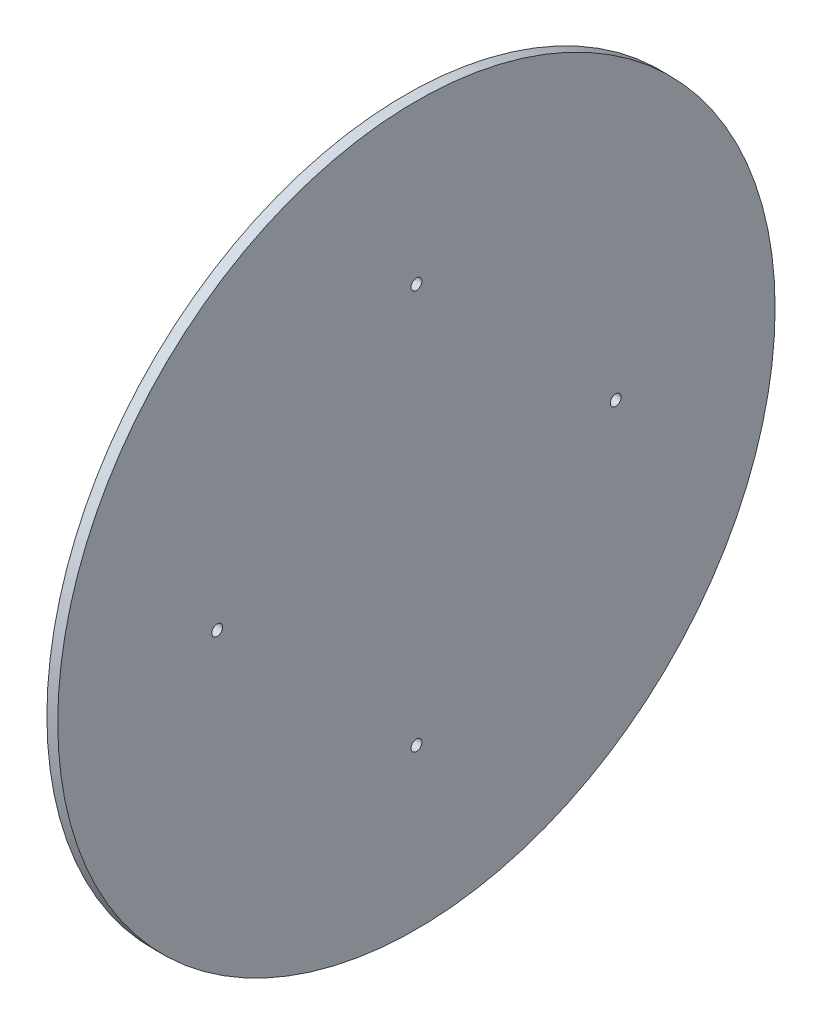
ISO-10303-21;
HEADER;
FILE_DESCRIPTION(('STEP AP214'),'2;1');
FILE_NAME('part.step','',(''),(''),'','','');
FILE_SCHEMA(('AUTOMOTIVE_DESIGN { 1 0 10303 214 1 1 1 1 }'));
ENDSEC;
DATA;
#1=APPLICATION_CONTEXT('core data for automotive mechanical design processes');
#2=APPLICATION_PROTOCOL_DEFINITION('international standard','automotive_design',2000,#1);
#3=PRODUCT_CONTEXT('',#1,'mechanical');
#4=PRODUCT('Part','Part','',(#3));
#5=PRODUCT_RELATED_PRODUCT_CATEGORY('part','',(#4));
#6=PRODUCT_DEFINITION_FORMATION('','',#4);
#7=PRODUCT_DEFINITION_CONTEXT('part definition',#1,'design');
#8=PRODUCT_DEFINITION('design','',#6,#7);
#9=PRODUCT_DEFINITION_SHAPE('','',#8);
#10=(LENGTH_UNIT() NAMED_UNIT(*) SI_UNIT(.MILLI.,.METRE.));
#11=(NAMED_UNIT(*) PLANE_ANGLE_UNIT() SI_UNIT($,.RADIAN.));
#12=(NAMED_UNIT(*) SI_UNIT($,.STERADIAN.) SOLID_ANGLE_UNIT());
#13=UNCERTAINTY_MEASURE_WITH_UNIT(LENGTH_MEASURE(1.E-05),#10,'distance_accuracy_value','');
#14=(GEOMETRIC_REPRESENTATION_CONTEXT(3) GLOBAL_UNCERTAINTY_ASSIGNED_CONTEXT((#13)) GLOBAL_UNIT_ASSIGNED_CONTEXT((#10,
#11,#12)) REPRESENTATION_CONTEXT('',''));
#15=CARTESIAN_POINT('',(0.,0.,0.));
#16=DIRECTION('',(0.,0.,1.));
#17=DIRECTION('',(1.,0.,0.));
#18=AXIS2_PLACEMENT_3D('',#15,#16,#17);
#19=CARTESIAN_POINT('',(3.,0.,-55.));
#20=DIRECTION('',(-1.,0.,0.));
#21=DIRECTION('',(0.,0.,1.));
#22=AXIS2_PLACEMENT_3D('',#19,#20,#21);
#23=CYLINDRICAL_SURFACE('',#22,1.5);
#24=CARTESIAN_POINT('',(3.,0.,-55.));
#25=DIRECTION('',(1.,0.,0.));
#26=DIRECTION('',(0.,0.,-1.));
#27=AXIS2_PLACEMENT_3D('',#24,#25,#26);
#28=CIRCLE('',#27,1.5);
#29=CARTESIAN_POINT('',(3.,0.,-56.5));
#30=VERTEX_POINT('',#29);
#31=EDGE_CURVE('E45',#30,#30,#28,.T.);
#32=ORIENTED_EDGE('',*,*,#31,.T.);
#33=EDGE_LOOP('',(#32));
#34=FACE_BOUND('',#33,.T.);
#35=CARTESIAN_POINT('',(0.,0.,-55.));
#36=DIRECTION('',(1.,0.,0.));
#37=DIRECTION('',(0.,0.,-1.));
#38=AXIS2_PLACEMENT_3D('',#35,#36,#37);
#39=CIRCLE('',#38,1.5);
#40=CARTESIAN_POINT('',(0.,0.,-56.5));
#41=VERTEX_POINT('',#40);
#42=EDGE_CURVE('E62',#41,#41,#39,.T.);
#43=ORIENTED_EDGE('',*,*,#42,.F.);
#44=EDGE_LOOP('',(#43));
#45=FACE_BOUND('',#44,.T.);
#46=ADVANCED_FACE('F37',(#34,#45),#23,.F.);
#47=CARTESIAN_POINT('',(3.,55.2062105868815,-0.00584184990515269));
#48=DIRECTION('',(-1.,0.,0.));
#49=DIRECTION('',(0.,0.,1.));
#50=AXIS2_PLACEMENT_3D('',#47,#48,#49);
#51=CYLINDRICAL_SURFACE('',#50,1.5);
#52=CARTESIAN_POINT('',(3.,55.2062105868815,-0.00584184990515269));
#53=DIRECTION('',(1.,0.,0.));
#54=DIRECTION('',(0.,0.,-1.));
#55=AXIS2_PLACEMENT_3D('',#52,#53,#54);
#56=CIRCLE('',#55,1.5);
#57=CARTESIAN_POINT('',(3.,55.2062105868815,-1.50584184990515));
#58=VERTEX_POINT('',#57);
#59=EDGE_CURVE('E50',#58,#58,#56,.T.);
#60=ORIENTED_EDGE('',*,*,#59,.T.);
#61=EDGE_LOOP('',(#60));
#62=FACE_BOUND('',#61,.T.);
#63=CARTESIAN_POINT('',(0.,55.2062105868815,-0.00584184990515269));
#64=DIRECTION('',(1.,0.,0.));
#65=DIRECTION('',(0.,0.,-1.));
#66=AXIS2_PLACEMENT_3D('',#63,#64,#65);
#67=CIRCLE('',#66,1.5);
#68=CARTESIAN_POINT('',(0.,55.2062105868815,-1.50584184990515));
#69=VERTEX_POINT('',#68);
#70=EDGE_CURVE('E60',#69,#69,#67,.T.);
#71=ORIENTED_EDGE('',*,*,#70,.F.);
#72=EDGE_LOOP('',(#71));
#73=FACE_BOUND('',#72,.T.);
#74=ADVANCED_FACE('F80',(#62,#73),#51,.F.);
#75=CARTESIAN_POINT('',(3.,0.,55.));
#76=DIRECTION('',(-1.,0.,0.));
#77=DIRECTION('',(0.,0.,1.));
#78=AXIS2_PLACEMENT_3D('',#75,#76,#77);
#79=CYLINDRICAL_SURFACE('',#78,1.5);
#80=CARTESIAN_POINT('',(3.,0.,55.));
#81=DIRECTION('',(1.,0.,0.));
#82=DIRECTION('',(0.,0.,-1.));
#83=AXIS2_PLACEMENT_3D('',#80,#81,#82);
#84=CIRCLE('',#83,1.5);
#85=CARTESIAN_POINT('',(3.,0.,53.5));
#86=VERTEX_POINT('',#85);
#87=EDGE_CURVE('E71',#86,#86,#84,.T.);
#88=ORIENTED_EDGE('',*,*,#87,.T.);
#89=EDGE_LOOP('',(#88));
#90=FACE_BOUND('',#89,.T.);
#91=CARTESIAN_POINT('',(0.,0.,55.));
#92=DIRECTION('',(1.,0.,0.));
#93=DIRECTION('',(0.,0.,-1.));
#94=AXIS2_PLACEMENT_3D('',#91,#92,#93);
#95=CIRCLE('',#94,1.5);
#96=CARTESIAN_POINT('',(0.,0.,53.5));
#97=VERTEX_POINT('',#96);
#98=EDGE_CURVE('E57',#97,#97,#95,.T.);
#99=ORIENTED_EDGE('',*,*,#98,.F.);
#100=EDGE_LOOP('',(#99));
#101=FACE_BOUND('',#100,.T.);
#102=ADVANCED_FACE('F98',(#90,#101),#79,.F.);
#103=CARTESIAN_POINT('',(3.,-55.,0.));
#104=DIRECTION('',(-1.,0.,0.));
#105=DIRECTION('',(0.,0.,1.));
#106=AXIS2_PLACEMENT_3D('',#103,#104,#105);
#107=CYLINDRICAL_SURFACE('',#106,1.5);
#108=CARTESIAN_POINT('',(3.,-55.,0.));
#109=DIRECTION('',(1.,0.,0.));
#110=DIRECTION('',(0.,0.,-1.));
#111=AXIS2_PLACEMENT_3D('',#108,#109,#110);
#112=CIRCLE('',#111,1.5);
#113=CARTESIAN_POINT('',(3.,-55.,-1.50000000000001));
#114=VERTEX_POINT('',#113);
#115=EDGE_CURVE('E67',#114,#114,#112,.T.);
#116=ORIENTED_EDGE('',*,*,#115,.T.);
#117=EDGE_LOOP('',(#116));
#118=FACE_BOUND('',#117,.T.);
#119=CARTESIAN_POINT('',(0.,-55.,0.));
#120=DIRECTION('',(1.,0.,0.));
#121=DIRECTION('',(0.,0.,-1.));
#122=AXIS2_PLACEMENT_3D('',#119,#120,#121);
#123=CIRCLE('',#122,1.5);
#124=CARTESIAN_POINT('',(0.,-55.,-1.50000000000001));
#125=VERTEX_POINT('',#124);
#126=EDGE_CURVE('E54',#125,#125,#123,.T.);
#127=ORIENTED_EDGE('',*,*,#126,.F.);
#128=EDGE_LOOP('',(#127));
#129=FACE_BOUND('',#128,.T.);
#130=ADVANCED_FACE('F39',(#118,#129),#107,.F.);
#131=CARTESIAN_POINT('',(3.,0.,0.));
#132=DIRECTION('',(-1.,0.,0.));
#133=DIRECTION('',(0.,0.,1.));
#134=AXIS2_PLACEMENT_3D('',#131,#132,#133);
#135=CYLINDRICAL_SURFACE('',#134,99.);
#136=CARTESIAN_POINT('',(3.,0.,0.));
#137=DIRECTION('',(1.,0.,0.));
#138=DIRECTION('',(0.,0.,-1.));
#139=AXIS2_PLACEMENT_3D('',#136,#137,#138);
#140=CIRCLE('',#139,99.);
#141=CARTESIAN_POINT('',(3.,0.,-99.));
#142=VERTEX_POINT('',#141);
#143=EDGE_CURVE('E10',#142,#142,#140,.T.);
#144=ORIENTED_EDGE('',*,*,#143,.F.);
#145=EDGE_LOOP('',(#144));
#146=FACE_BOUND('',#145,.T.);
#147=CARTESIAN_POINT('',(0.,0.,0.));
#148=DIRECTION('',(1.,0.,0.));
#149=DIRECTION('',(0.,0.,-1.));
#150=AXIS2_PLACEMENT_3D('',#147,#148,#149);
#151=CIRCLE('',#150,99.);
#152=CARTESIAN_POINT('',(0.,0.,-99.));
#153=VERTEX_POINT('',#152);
#154=EDGE_CURVE('E41',#153,#153,#151,.T.);
#155=ORIENTED_EDGE('',*,*,#154,.T.);
#156=EDGE_LOOP('',(#155));
#157=FACE_BOUND('',#156,.T.);
#158=ADVANCED_FACE('F87',(#146,#157),#135,.T.);
#159=CARTESIAN_POINT('',(3.,0.,0.));
#160=DIRECTION('',(1.,0.,0.));
#161=DIRECTION('',(0.,0.,-1.));
#162=AXIS2_PLACEMENT_3D('',#159,#160,#161);
#163=PLANE('',#162);
#164=ORIENTED_EDGE('',*,*,#115,.F.);
#165=EDGE_LOOP('',(#164));
#166=FACE_BOUND('',#165,.T.);
#167=ORIENTED_EDGE('',*,*,#87,.F.);
#168=EDGE_LOOP('',(#167));
#169=FACE_BOUND('',#168,.T.);
#170=ORIENTED_EDGE('',*,*,#59,.F.);
#171=EDGE_LOOP('',(#170));
#172=FACE_BOUND('',#171,.T.);
#173=ORIENTED_EDGE('',*,*,#31,.F.);
#174=EDGE_LOOP('',(#173));
#175=FACE_BOUND('',#174,.T.);
#176=ORIENTED_EDGE('',*,*,#143,.T.);
#177=EDGE_LOOP('',(#176));
#178=FACE_BOUND('',#177,.T.);
#179=ADVANCED_FACE('F83',(#166,#169,#172,#175,#178),#163,.T.);
#180=CARTESIAN_POINT('',(0.,0.,0.));
#181=DIRECTION('',(1.,0.,0.));
#182=DIRECTION('',(0.,0.,-1.));
#183=AXIS2_PLACEMENT_3D('',#180,#181,#182);
#184=PLANE('',#183);
#185=ORIENTED_EDGE('',*,*,#126,.T.);
#186=EDGE_LOOP('',(#185));
#187=FACE_BOUND('',#186,.T.);
#188=ORIENTED_EDGE('',*,*,#98,.T.);
#189=EDGE_LOOP('',(#188));
#190=FACE_BOUND('',#189,.T.);
#191=ORIENTED_EDGE('',*,*,#70,.T.);
#192=EDGE_LOOP('',(#191));
#193=FACE_BOUND('',#192,.T.);
#194=ORIENTED_EDGE('',*,*,#42,.T.);
#195=EDGE_LOOP('',(#194));
#196=FACE_BOUND('',#195,.T.);
#197=ORIENTED_EDGE('',*,*,#154,.F.);
#198=EDGE_LOOP('',(#197));
#199=FACE_BOUND('',#198,.T.);
#200=ADVANCED_FACE('F86',(#187,#190,#193,#196,#199),#184,.F.);
#201=CLOSED_SHELL('',(#46,#74,#102,#130,#158,#179,#200));
#202=MANIFOLD_SOLID_BREP('B2',#201);
#203=ADVANCED_BREP_SHAPE_REPRESENTATION('',(#18,#202),#14);
#204=SHAPE_DEFINITION_REPRESENTATION(#9,#203);
ENDSEC;
END-ISO-10303-21;
